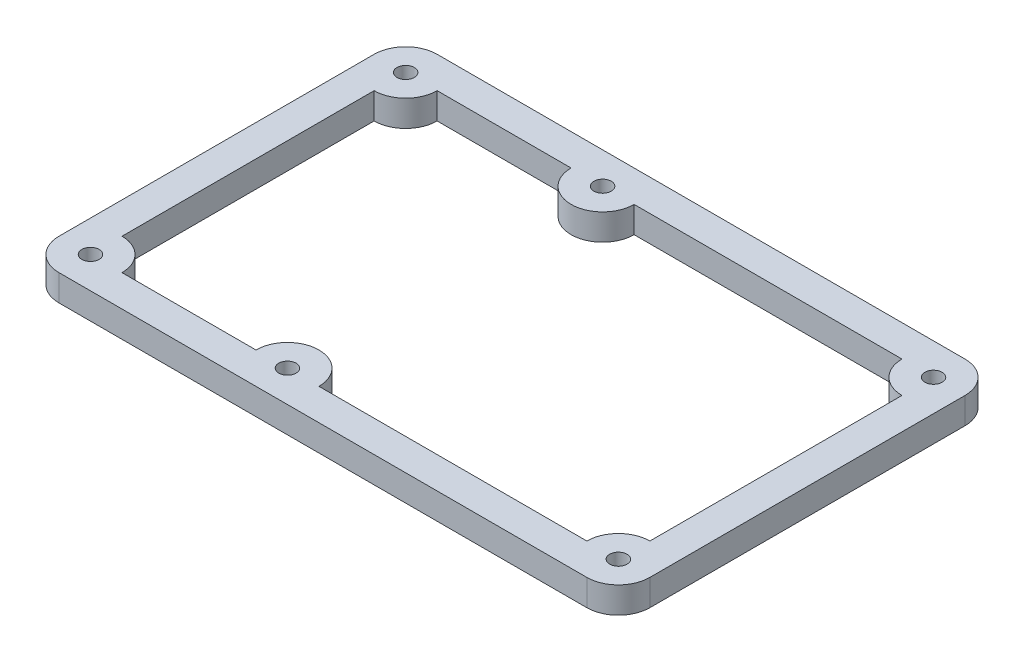
ISO-10303-21;
HEADER;
FILE_DESCRIPTION(('STEP AP214'),'2;1');
FILE_NAME('part.step','',(''),(''),'','','');
FILE_SCHEMA(('AUTOMOTIVE_DESIGN { 1 0 10303 214 1 1 1 1 }'));
ENDSEC;
DATA;
#1=APPLICATION_CONTEXT('core data for automotive mechanical design processes');
#2=APPLICATION_PROTOCOL_DEFINITION('international standard','automotive_design',2000,#1);
#3=PRODUCT_CONTEXT('',#1,'mechanical');
#4=PRODUCT('Part','Part','',(#3));
#5=PRODUCT_RELATED_PRODUCT_CATEGORY('part','',(#4));
#6=PRODUCT_DEFINITION_FORMATION('','',#4);
#7=PRODUCT_DEFINITION_CONTEXT('part definition',#1,'design');
#8=PRODUCT_DEFINITION('design','',#6,#7);
#9=PRODUCT_DEFINITION_SHAPE('','',#8);
#10=(LENGTH_UNIT() NAMED_UNIT(*) SI_UNIT(.MILLI.,.METRE.));
#11=(NAMED_UNIT(*) PLANE_ANGLE_UNIT() SI_UNIT($,.RADIAN.));
#12=(NAMED_UNIT(*) SI_UNIT($,.STERADIAN.) SOLID_ANGLE_UNIT());
#13=UNCERTAINTY_MEASURE_WITH_UNIT(LENGTH_MEASURE(1.E-05),#10,'distance_accuracy_value','');
#14=(GEOMETRIC_REPRESENTATION_CONTEXT(3) GLOBAL_UNCERTAINTY_ASSIGNED_CONTEXT((#13)) GLOBAL_UNIT_ASSIGNED_CONTEXT((#10,
#11,#12)) REPRESENTATION_CONTEXT('',''));
#15=CARTESIAN_POINT('',(0.,0.,0.));
#16=DIRECTION('',(0.,0.,1.));
#17=DIRECTION('',(1.,0.,0.));
#18=AXIS2_PLACEMENT_3D('',#15,#16,#17);
#19=CARTESIAN_POINT('',(-56.7858356822057,5.,-53.1366399068793));
#20=DIRECTION('',(0.,1.,0.));
#21=DIRECTION('',(0.,0.,1.));
#22=AXIS2_PLACEMENT_3D('',#19,#20,#21);
#23=PLANE('',#22);
#24=CARTESIAN_POINT('',(43.7141643177943,5.,6.86336009312072));
#25=DIRECTION('',(0.,1.,0.));
#26=DIRECTION('',(0.,0.,1.));
#27=AXIS2_PLACEMENT_3D('',#24,#25,#26);
#28=CIRCLE('',#27,1.65);
#29=CARTESIAN_POINT('',(43.7141643177943,5.,8.51336009312071));
#30=VERTEX_POINT('',#29);
#31=EDGE_CURVE('E263',#30,#30,#28,.T.);
#32=ORIENTED_EDGE('',*,*,#31,.F.);
#33=EDGE_LOOP('',(#32));
#34=FACE_BOUND('',#33,.T.);
#35=CARTESIAN_POINT('',(-56.7858356822057,5.,6.86336009312072));
#36=DIRECTION('',(0.,1.,0.));
#37=DIRECTION('',(0.,0.,1.));
#38=AXIS2_PLACEMENT_3D('',#35,#36,#37);
#39=CIRCLE('',#38,1.65);
#40=CARTESIAN_POINT('',(-56.7858356822057,5.,8.51336009312072));
#41=VERTEX_POINT('',#40);
#42=EDGE_CURVE('E275',#41,#41,#39,.T.);
#43=ORIENTED_EDGE('',*,*,#42,.F.);
#44=EDGE_LOOP('',(#43));
#45=FACE_BOUND('',#44,.T.);
#46=CARTESIAN_POINT('',(-19.2858356822057,5.,-53.1366399068793));
#47=DIRECTION('',(0.,1.,0.));
#48=DIRECTION('',(0.,0.,1.));
#49=AXIS2_PLACEMENT_3D('',#46,#47,#48);
#50=CIRCLE('',#49,1.65);
#51=CARTESIAN_POINT('',(-19.2858356822057,5.,-51.4866399068793));
#52=VERTEX_POINT('',#51);
#53=EDGE_CURVE('E287',#52,#52,#50,.T.);
#54=ORIENTED_EDGE('',*,*,#53,.F.);
#55=EDGE_LOOP('',(#54));
#56=FACE_BOUND('',#55,.T.);
#57=CARTESIAN_POINT('',(-56.7858356822057,5.,-53.1366399068793));
#58=DIRECTION('',(0.,1.,0.));
#59=DIRECTION('',(0.,0.,1.));
#60=AXIS2_PLACEMENT_3D('',#57,#58,#59);
#61=CIRCLE('',#60,6.00000000000001);
#62=CARTESIAN_POINT('',(-56.7858356822057,5.,-59.1366399068793));
#63=VERTEX_POINT('',#62);
#64=CARTESIAN_POINT('',(-62.7858356822058,5.,-53.1366399068793));
#65=VERTEX_POINT('',#64);
#66=EDGE_CURVE('E299',#63,#65,#61,.T.);
#67=ORIENTED_EDGE('',*,*,#66,.T.);
#68=DIRECTION('',(0.,0.,1.));
#69=VECTOR('',#68,1.);
#70=CARTESIAN_POINT('',(-62.7858356822058,5.,-53.1366399068793));
#71=LINE('',#70,#69);
#72=CARTESIAN_POINT('',(-62.7858356822058,5.,6.86336009312072));
#73=VERTEX_POINT('',#72);
#74=EDGE_CURVE('E302',#65,#73,#71,.T.);
#75=ORIENTED_EDGE('',*,*,#74,.T.);
#76=CARTESIAN_POINT('',(-56.7858356822057,5.,6.86336009312072));
#77=DIRECTION('',(0.,1.,0.));
#78=DIRECTION('',(0.,0.,1.));
#79=AXIS2_PLACEMENT_3D('',#76,#77,#78);
#80=CIRCLE('',#79,6.);
#81=CARTESIAN_POINT('',(-56.7858356822057,5.,12.8633600931207));
#82=VERTEX_POINT('',#81);
#83=EDGE_CURVE('E305',#73,#82,#80,.T.);
#84=ORIENTED_EDGE('',*,*,#83,.T.);
#85=DIRECTION('',(1.,0.,0.));
#86=VECTOR('',#85,1.);
#87=CARTESIAN_POINT('',(-56.7858356822057,5.,12.8633600931207));
#88=LINE('',#87,#86);
#89=CARTESIAN_POINT('',(43.7141643177943,5.,12.8633600931207));
#90=VERTEX_POINT('',#89);
#91=EDGE_CURVE('E307',#82,#90,#88,.T.);
#92=ORIENTED_EDGE('',*,*,#91,.T.);
#93=CARTESIAN_POINT('',(43.7141643177943,5.,6.86336009312072));
#94=DIRECTION('',(0.,1.,0.));
#95=DIRECTION('',(0.,0.,1.));
#96=AXIS2_PLACEMENT_3D('',#93,#94,#95);
#97=CIRCLE('',#96,6.);
#98=CARTESIAN_POINT('',(49.7141643177943,5.,6.86336009312072));
#99=VERTEX_POINT('',#98);
#100=EDGE_CURVE('E309',#90,#99,#97,.T.);
#101=ORIENTED_EDGE('',*,*,#100,.T.);
#102=DIRECTION('',(0.,0.,-1.));
#103=VECTOR('',#102,1.);
#104=CARTESIAN_POINT('',(49.7141643177943,5.,-53.1366399068793));
#105=LINE('',#104,#103);
#106=CARTESIAN_POINT('',(49.7141643177943,5.,-53.1366399068793));
#107=VERTEX_POINT('',#106);
#108=EDGE_CURVE('E311',#99,#107,#105,.T.);
#109=ORIENTED_EDGE('',*,*,#108,.T.);
#110=CARTESIAN_POINT('',(43.7141643177943,5.,-53.1366399068793));
#111=DIRECTION('',(0.,1.,0.));
#112=DIRECTION('',(0.,0.,1.));
#113=AXIS2_PLACEMENT_3D('',#110,#111,#112);
#114=CIRCLE('',#113,5.99999999999999);
#115=CARTESIAN_POINT('',(43.7141643177943,5.,-59.1366399068793));
#116=VERTEX_POINT('',#115);
#117=EDGE_CURVE('E313',#107,#116,#114,.T.);
#118=ORIENTED_EDGE('',*,*,#117,.T.);
#119=DIRECTION('',(-1.,0.,0.));
#120=VECTOR('',#119,1.);
#121=CARTESIAN_POINT('',(-56.7858356822057,5.,-59.1366399068793));
#122=LINE('',#121,#120);
#123=EDGE_CURVE('E315',#116,#63,#122,.T.);
#124=ORIENTED_EDGE('',*,*,#123,.T.);
#125=EDGE_LOOP('',(#67,#75,#84,#92,#101,#109,#118,#124));
#126=FACE_BOUND('',#125,.T.);
#127=CARTESIAN_POINT('',(-56.7858356822057,5.,-53.1366399068793));
#128=DIRECTION('',(0.,1.,0.));
#129=DIRECTION('',(0.,0.,1.));
#130=AXIS2_PLACEMENT_3D('',#127,#128,#129);
#131=CIRCLE('',#130,1.65);
#132=CARTESIAN_POINT('',(-56.7858356822057,5.,-51.4866399068793));
#133=VERTEX_POINT('',#132);
#134=EDGE_CURVE('E293',#133,#133,#131,.T.);
#135=ORIENTED_EDGE('',*,*,#134,.F.);
#136=EDGE_LOOP('',(#135));
#137=FACE_BOUND('',#136,.T.);
#138=CARTESIAN_POINT('',(43.7141643177943,5.,-53.1366399068793));
#139=DIRECTION('',(0.,1.,0.));
#140=DIRECTION('',(0.,0.,1.));
#141=AXIS2_PLACEMENT_3D('',#138,#139,#140);
#142=CIRCLE('',#141,1.65);
#143=CARTESIAN_POINT('',(43.7141643177943,5.,-51.4866399068793));
#144=VERTEX_POINT('',#143);
#145=EDGE_CURVE('E281',#144,#144,#142,.T.);
#146=ORIENTED_EDGE('',*,*,#145,.F.);
#147=EDGE_LOOP('',(#146));
#148=FACE_BOUND('',#147,.T.);
#149=CARTESIAN_POINT('',(-19.2858356822057,5.,6.86336009312072));
#150=DIRECTION('',(0.,1.,0.));
#151=DIRECTION('',(0.,0.,1.));
#152=AXIS2_PLACEMENT_3D('',#149,#150,#151);
#153=CIRCLE('',#152,1.65);
#154=CARTESIAN_POINT('',(-19.2858356822057,5.,8.51336009312072));
#155=VERTEX_POINT('',#154);
#156=EDGE_CURVE('E269',#155,#155,#153,.T.);
#157=ORIENTED_EDGE('',*,*,#156,.F.);
#158=EDGE_LOOP('',(#157));
#159=FACE_BOUND('',#158,.T.);
#160=DIRECTION('',(0.,0.,1.));
#161=VECTOR('',#160,1.);
#162=CARTESIAN_POINT('',(-56.7858356822057,5.,0.863360093120715));
#163=LINE('',#162,#161);
#164=CARTESIAN_POINT('',(-56.7858356822057,5.,-47.1366399068793));
#165=VERTEX_POINT('',#164);
#166=CARTESIAN_POINT('',(-56.7858356822057,5.,0.863360093120715));
#167=VERTEX_POINT('',#166);
#168=EDGE_CURVE('E178',#165,#167,#163,.T.);
#169=ORIENTED_EDGE('',*,*,#168,.F.);
#170=CARTESIAN_POINT('',(-56.7858356822057,5.,-53.1366399068793));
#171=DIRECTION('',(0.,-1.,0.));
#172=DIRECTION('',(0.,0.,1.));
#173=AXIS2_PLACEMENT_3D('',#170,#171,#172);
#174=CIRCLE('',#173,6.00000000000001);
#175=CARTESIAN_POINT('',(-50.7858356822057,5.,-53.1366399068793));
#176=VERTEX_POINT('',#175);
#177=EDGE_CURVE('E170',#176,#165,#174,.T.);
#178=ORIENTED_EDGE('',*,*,#177,.F.);
#179=DIRECTION('',(-1.,0.,0.));
#180=VECTOR('',#179,1.);
#181=CARTESIAN_POINT('',(-50.7858356822057,5.,-53.1366399068793));
#182=LINE('',#181,#180);
#183=CARTESIAN_POINT('',(-25.2858356822057,5.,-53.1366399068793));
#184=VERTEX_POINT('',#183);
#185=EDGE_CURVE('E211',#184,#176,#182,.T.);
#186=ORIENTED_EDGE('',*,*,#185,.F.);
#187=CARTESIAN_POINT('',(-19.2858356822057,5.,-53.1366399068793));
#188=DIRECTION('',(0.,-1.,0.));
#189=DIRECTION('',(0.,0.,1.));
#190=AXIS2_PLACEMENT_3D('',#187,#188,#189);
#191=CIRCLE('',#190,6.);
#192=CARTESIAN_POINT('',(-13.2858356822057,5.,-53.1366399068793));
#193=VERTEX_POINT('',#192);
#194=EDGE_CURVE('E209',#193,#184,#191,.T.);
#195=ORIENTED_EDGE('',*,*,#194,.F.);
#196=DIRECTION('',(-1.,0.,0.));
#197=VECTOR('',#196,1.);
#198=CARTESIAN_POINT('',(-13.2858356822057,5.,-53.1366399068793));
#199=LINE('',#198,#197);
#200=CARTESIAN_POINT('',(37.7141643177943,5.,-53.1366399068793));
#201=VERTEX_POINT('',#200);
#202=EDGE_CURVE('E207',#201,#193,#199,.T.);
#203=ORIENTED_EDGE('',*,*,#202,.F.);
#204=CARTESIAN_POINT('',(43.7141643177943,5.,-53.1366399068793));
#205=DIRECTION('',(0.,-1.,0.));
#206=DIRECTION('',(0.,0.,1.));
#207=AXIS2_PLACEMENT_3D('',#204,#205,#206);
#208=CIRCLE('',#207,5.99999999999999);
#209=CARTESIAN_POINT('',(43.7141643177943,5.,-47.1366399068793));
#210=VERTEX_POINT('',#209);
#211=EDGE_CURVE('E205',#210,#201,#208,.T.);
#212=ORIENTED_EDGE('',*,*,#211,.F.);
#213=DIRECTION('',(0.,0.,-1.));
#214=VECTOR('',#213,1.);
#215=CARTESIAN_POINT('',(43.7141643177943,5.,-47.1366399068793));
#216=LINE('',#215,#214);
#217=CARTESIAN_POINT('',(43.7141643177943,5.,0.863360093120722));
#218=VERTEX_POINT('',#217);
#219=EDGE_CURVE('E203',#218,#210,#216,.T.);
#220=ORIENTED_EDGE('',*,*,#219,.F.);
#221=CARTESIAN_POINT('',(43.7141643177943,5.,6.86336009312072));
#222=DIRECTION('',(0.,-1.,0.));
#223=DIRECTION('',(0.,0.,1.));
#224=AXIS2_PLACEMENT_3D('',#221,#222,#223);
#225=CIRCLE('',#224,6.);
#226=CARTESIAN_POINT('',(37.7141643177943,5.,6.86336009312072));
#227=VERTEX_POINT('',#226);
#228=EDGE_CURVE('E201',#227,#218,#225,.T.);
#229=ORIENTED_EDGE('',*,*,#228,.F.);
#230=DIRECTION('',(1.,0.,0.));
#231=VECTOR('',#230,1.);
#232=CARTESIAN_POINT('',(37.7141643177943,5.,6.86336009312072));
#233=LINE('',#232,#231);
#234=CARTESIAN_POINT('',(-13.2858356822057,5.,6.86336009312072));
#235=VERTEX_POINT('',#234);
#236=EDGE_CURVE('E199',#235,#227,#233,.T.);
#237=ORIENTED_EDGE('',*,*,#236,.F.);
#238=CARTESIAN_POINT('',(-19.2858356822057,5.,6.86336009312072));
#239=DIRECTION('',(0.,-1.,0.));
#240=DIRECTION('',(0.,0.,1.));
#241=AXIS2_PLACEMENT_3D('',#238,#239,#240);
#242=CIRCLE('',#241,6.);
#243=CARTESIAN_POINT('',(-25.2858356822057,5.,6.86336009312072));
#244=VERTEX_POINT('',#243);
#245=EDGE_CURVE('E197',#244,#235,#242,.T.);
#246=ORIENTED_EDGE('',*,*,#245,.F.);
#247=DIRECTION('',(1.,0.,0.));
#248=VECTOR('',#247,1.);
#249=CARTESIAN_POINT('',(-50.7858356822057,5.,6.86336009312072));
#250=LINE('',#249,#248);
#251=CARTESIAN_POINT('',(-50.7858356822057,5.,6.86336009312072));
#252=VERTEX_POINT('',#251);
#253=EDGE_CURVE('E193',#252,#244,#250,.T.);
#254=ORIENTED_EDGE('',*,*,#253,.F.);
#255=CARTESIAN_POINT('',(-56.7858356822057,5.,6.86336009312072));
#256=DIRECTION('',(0.,-1.,0.));
#257=DIRECTION('',(0.,0.,1.));
#258=AXIS2_PLACEMENT_3D('',#255,#256,#257);
#259=CIRCLE('',#258,6.);
#260=EDGE_CURVE('E191',#167,#252,#259,.T.);
#261=ORIENTED_EDGE('',*,*,#260,.F.);
#262=EDGE_LOOP('',(#169,#178,#186,#195,#203,#212,#220,#229,#237,#246,#254,#261));
#263=FACE_BOUND('',#262,.T.);
#264=ADVANCED_FACE('F33',(#34,#45,#56,#126,#137,#148,#159,#263),#23,.T.);
#265=CARTESIAN_POINT('',(-56.7858356822057,0.,-53.1366399068793));
#266=DIRECTION('',(0.,1.,0.));
#267=DIRECTION('',(0.,0.,1.));
#268=AXIS2_PLACEMENT_3D('',#265,#266,#267);
#269=PLANE('',#268);
#270=CARTESIAN_POINT('',(43.7141643177943,0.,6.86336009312072));
#271=DIRECTION('',(0.,1.,0.));
#272=DIRECTION('',(0.,0.,1.));
#273=AXIS2_PLACEMENT_3D('',#270,#271,#272);
#274=CIRCLE('',#273,1.65);
#275=CARTESIAN_POINT('',(43.7141643177943,0.,8.51336009312071));
#276=VERTEX_POINT('',#275);
#277=EDGE_CURVE('E186',#276,#276,#274,.T.);
#278=ORIENTED_EDGE('',*,*,#277,.T.);
#279=EDGE_LOOP('',(#278));
#280=FACE_BOUND('',#279,.T.);
#281=CARTESIAN_POINT('',(-56.7858356822057,0.,6.86336009312072));
#282=DIRECTION('',(0.,1.,0.));
#283=DIRECTION('',(0.,0.,1.));
#284=AXIS2_PLACEMENT_3D('',#281,#282,#283);
#285=CIRCLE('',#284,1.65);
#286=CARTESIAN_POINT('',(-56.7858356822057,0.,8.51336009312072));
#287=VERTEX_POINT('',#286);
#288=EDGE_CURVE('E272',#287,#287,#285,.T.);
#289=ORIENTED_EDGE('',*,*,#288,.T.);
#290=EDGE_LOOP('',(#289));
#291=FACE_BOUND('',#290,.T.);
#292=CARTESIAN_POINT('',(-19.2858356822057,0.,-53.1366399068793));
#293=DIRECTION('',(0.,1.,0.));
#294=DIRECTION('',(0.,0.,1.));
#295=AXIS2_PLACEMENT_3D('',#292,#293,#294);
#296=CIRCLE('',#295,1.65);
#297=CARTESIAN_POINT('',(-19.2858356822057,0.,-51.4866399068793));
#298=VERTEX_POINT('',#297);
#299=EDGE_CURVE('E284',#298,#298,#296,.T.);
#300=ORIENTED_EDGE('',*,*,#299,.T.);
#301=EDGE_LOOP('',(#300));
#302=FACE_BOUND('',#301,.T.);
#303=CARTESIAN_POINT('',(-56.7858356822057,0.,-53.1366399068793));
#304=DIRECTION('',(0.,1.,0.));
#305=DIRECTION('',(0.,0.,1.));
#306=AXIS2_PLACEMENT_3D('',#303,#304,#305);
#307=CIRCLE('',#306,6.00000000000001);
#308=CARTESIAN_POINT('',(-56.7858356822057,0.,-59.1366399068793));
#309=VERTEX_POINT('',#308);
#310=CARTESIAN_POINT('',(-62.7858356822058,0.,-53.1366399068793));
#311=VERTEX_POINT('',#310);
#312=EDGE_CURVE('E296',#309,#311,#307,.T.);
#313=ORIENTED_EDGE('',*,*,#312,.F.);
#314=DIRECTION('',(-1.,0.,0.));
#315=VECTOR('',#314,1.);
#316=CARTESIAN_POINT('',(-56.7858356822057,0.,-59.1366399068793));
#317=LINE('',#316,#315);
#318=CARTESIAN_POINT('',(43.7141643177943,0.,-59.1366399068793));
#319=VERTEX_POINT('',#318);
#320=EDGE_CURVE('E303',#319,#309,#317,.T.);
#321=ORIENTED_EDGE('',*,*,#320,.F.);
#322=CARTESIAN_POINT('',(43.7141643177943,0.,-53.1366399068793));
#323=DIRECTION('',(0.,1.,0.));
#324=DIRECTION('',(0.,0.,1.));
#325=AXIS2_PLACEMENT_3D('',#322,#323,#324);
#326=CIRCLE('',#325,5.99999999999999);
#327=CARTESIAN_POINT('',(49.7141643177943,0.,-53.1366399068793));
#328=VERTEX_POINT('',#327);
#329=EDGE_CURVE('E330',#328,#319,#326,.T.);
#330=ORIENTED_EDGE('',*,*,#329,.F.);
#331=DIRECTION('',(0.,0.,-1.));
#332=VECTOR('',#331,1.);
#333=CARTESIAN_POINT('',(49.7141643177943,0.,-53.1366399068793));
#334=LINE('',#333,#332);
#335=CARTESIAN_POINT('',(49.7141643177943,0.,6.86336009312072));
#336=VERTEX_POINT('',#335);
#337=EDGE_CURVE('E328',#336,#328,#334,.T.);
#338=ORIENTED_EDGE('',*,*,#337,.F.);
#339=CARTESIAN_POINT('',(43.7141643177943,0.,6.86336009312072));
#340=DIRECTION('',(0.,1.,0.));
#341=DIRECTION('',(0.,0.,1.));
#342=AXIS2_PLACEMENT_3D('',#339,#340,#341);
#343=CIRCLE('',#342,6.);
#344=CARTESIAN_POINT('',(43.7141643177943,0.,12.8633600931207));
#345=VERTEX_POINT('',#344);
#346=EDGE_CURVE('E326',#345,#336,#343,.T.);
#347=ORIENTED_EDGE('',*,*,#346,.F.);
#348=DIRECTION('',(1.,0.,0.));
#349=VECTOR('',#348,1.);
#350=CARTESIAN_POINT('',(-56.7858356822057,0.,12.8633600931207));
#351=LINE('',#350,#349);
#352=CARTESIAN_POINT('',(-56.7858356822057,0.,12.8633600931207));
#353=VERTEX_POINT('',#352);
#354=EDGE_CURVE('E324',#353,#345,#351,.T.);
#355=ORIENTED_EDGE('',*,*,#354,.F.);
#356=CARTESIAN_POINT('',(-56.7858356822057,0.,6.86336009312072));
#357=DIRECTION('',(0.,1.,0.));
#358=DIRECTION('',(0.,0.,1.));
#359=AXIS2_PLACEMENT_3D('',#356,#357,#358);
#360=CIRCLE('',#359,6.);
#361=CARTESIAN_POINT('',(-62.7858356822058,0.,6.86336009312072));
#362=VERTEX_POINT('',#361);
#363=EDGE_CURVE('E322',#362,#353,#360,.T.);
#364=ORIENTED_EDGE('',*,*,#363,.F.);
#365=DIRECTION('',(0.,0.,1.));
#366=VECTOR('',#365,1.);
#367=CARTESIAN_POINT('',(-62.7858356822058,0.,-53.1366399068793));
#368=LINE('',#367,#366);
#369=EDGE_CURVE('E320',#311,#362,#368,.T.);
#370=ORIENTED_EDGE('',*,*,#369,.F.);
#371=EDGE_LOOP('',(#313,#321,#330,#338,#347,#355,#364,#370));
#372=FACE_BOUND('',#371,.T.);
#373=CARTESIAN_POINT('',(-56.7858356822057,0.,-53.1366399068793));
#374=DIRECTION('',(0.,1.,0.));
#375=DIRECTION('',(0.,0.,1.));
#376=AXIS2_PLACEMENT_3D('',#373,#374,#375);
#377=CIRCLE('',#376,1.65);
#378=CARTESIAN_POINT('',(-56.7858356822057,0.,-51.4866399068793));
#379=VERTEX_POINT('',#378);
#380=EDGE_CURVE('E290',#379,#379,#377,.T.);
#381=ORIENTED_EDGE('',*,*,#380,.T.);
#382=EDGE_LOOP('',(#381));
#383=FACE_BOUND('',#382,.T.);
#384=CARTESIAN_POINT('',(43.7141643177943,0.,-53.1366399068793));
#385=DIRECTION('',(0.,1.,0.));
#386=DIRECTION('',(0.,0.,1.));
#387=AXIS2_PLACEMENT_3D('',#384,#385,#386);
#388=CIRCLE('',#387,1.65);
#389=CARTESIAN_POINT('',(43.7141643177943,0.,-51.4866399068793));
#390=VERTEX_POINT('',#389);
#391=EDGE_CURVE('E278',#390,#390,#388,.T.);
#392=ORIENTED_EDGE('',*,*,#391,.T.);
#393=EDGE_LOOP('',(#392));
#394=FACE_BOUND('',#393,.T.);
#395=CARTESIAN_POINT('',(-19.2858356822057,0.,6.86336009312072));
#396=DIRECTION('',(0.,1.,0.));
#397=DIRECTION('',(0.,0.,1.));
#398=AXIS2_PLACEMENT_3D('',#395,#396,#397);
#399=CIRCLE('',#398,1.65);
#400=CARTESIAN_POINT('',(-19.2858356822057,0.,8.51336009312072));
#401=VERTEX_POINT('',#400);
#402=EDGE_CURVE('E266',#401,#401,#399,.T.);
#403=ORIENTED_EDGE('',*,*,#402,.T.);
#404=EDGE_LOOP('',(#403));
#405=FACE_BOUND('',#404,.T.);
#406=CARTESIAN_POINT('',(-56.7858356822057,0.,-53.1366399068793));
#407=DIRECTION('',(0.,-1.,0.));
#408=DIRECTION('',(0.,0.,1.));
#409=AXIS2_PLACEMENT_3D('',#406,#407,#408);
#410=CIRCLE('',#409,6.00000000000001);
#411=CARTESIAN_POINT('',(-50.7858356822057,0.,-53.1366399068793));
#412=VERTEX_POINT('',#411);
#413=CARTESIAN_POINT('',(-56.7858356822057,0.,-47.1366399068793));
#414=VERTEX_POINT('',#413);
#415=EDGE_CURVE('E56',#412,#414,#410,.T.);
#416=ORIENTED_EDGE('',*,*,#415,.T.);
#417=DIRECTION('',(0.,0.,1.));
#418=VECTOR('',#417,1.);
#419=CARTESIAN_POINT('',(-56.7858356822057,0.,0.863360093120715));
#420=LINE('',#419,#418);
#421=CARTESIAN_POINT('',(-56.7858356822057,0.,0.863360093120715));
#422=VERTEX_POINT('',#421);
#423=EDGE_CURVE('E185',#414,#422,#420,.T.);
#424=ORIENTED_EDGE('',*,*,#423,.T.);
#425=CARTESIAN_POINT('',(-56.7858356822057,0.,6.86336009312072));
#426=DIRECTION('',(0.,-1.,0.));
#427=DIRECTION('',(0.,0.,1.));
#428=AXIS2_PLACEMENT_3D('',#425,#426,#427);
#429=CIRCLE('',#428,6.);
#430=CARTESIAN_POINT('',(-50.7858356822057,0.,6.86336009312072));
#431=VERTEX_POINT('',#430);
#432=EDGE_CURVE('E215',#422,#431,#429,.T.);
#433=ORIENTED_EDGE('',*,*,#432,.T.);
#434=DIRECTION('',(1.,0.,0.));
#435=VECTOR('',#434,1.);
#436=CARTESIAN_POINT('',(-50.7858356822057,0.,6.86336009312072));
#437=LINE('',#436,#435);
#438=CARTESIAN_POINT('',(-25.2858356822057,0.,6.86336009312072));
#439=VERTEX_POINT('',#438);
#440=EDGE_CURVE('E218',#431,#439,#437,.T.);
#441=ORIENTED_EDGE('',*,*,#440,.T.);
#442=CARTESIAN_POINT('',(-19.2858356822057,0.,6.86336009312072));
#443=DIRECTION('',(0.,-1.,0.));
#444=DIRECTION('',(0.,0.,1.));
#445=AXIS2_PLACEMENT_3D('',#442,#443,#444);
#446=CIRCLE('',#445,6.);
#447=CARTESIAN_POINT('',(-13.2858356822057,0.,6.86336009312072));
#448=VERTEX_POINT('',#447);
#449=EDGE_CURVE('E221',#439,#448,#446,.T.);
#450=ORIENTED_EDGE('',*,*,#449,.T.);
#451=DIRECTION('',(1.,0.,0.));
#452=VECTOR('',#451,1.);
#453=CARTESIAN_POINT('',(37.7141643177943,0.,6.86336009312072));
#454=LINE('',#453,#452);
#455=CARTESIAN_POINT('',(37.7141643177943,0.,6.86336009312072));
#456=VERTEX_POINT('',#455);
#457=EDGE_CURVE('E224',#448,#456,#454,.T.);
#458=ORIENTED_EDGE('',*,*,#457,.T.);
#459=CARTESIAN_POINT('',(43.7141643177943,0.,6.86336009312072));
#460=DIRECTION('',(0.,-1.,0.));
#461=DIRECTION('',(0.,0.,1.));
#462=AXIS2_PLACEMENT_3D('',#459,#460,#461);
#463=CIRCLE('',#462,6.);
#464=CARTESIAN_POINT('',(43.7141643177943,0.,0.863360093120722));
#465=VERTEX_POINT('',#464);
#466=EDGE_CURVE('E227',#456,#465,#463,.T.);
#467=ORIENTED_EDGE('',*,*,#466,.T.);
#468=DIRECTION('',(0.,0.,-1.));
#469=VECTOR('',#468,1.);
#470=CARTESIAN_POINT('',(43.7141643177943,0.,-47.1366399068793));
#471=LINE('',#470,#469);
#472=CARTESIAN_POINT('',(43.7141643177943,0.,-47.1366399068793));
#473=VERTEX_POINT('',#472);
#474=EDGE_CURVE('E230',#465,#473,#471,.T.);
#475=ORIENTED_EDGE('',*,*,#474,.T.);
#476=CARTESIAN_POINT('',(43.7141643177943,0.,-53.1366399068793));
#477=DIRECTION('',(0.,-1.,0.));
#478=DIRECTION('',(0.,0.,1.));
#479=AXIS2_PLACEMENT_3D('',#476,#477,#478);
#480=CIRCLE('',#479,5.99999999999999);
#481=CARTESIAN_POINT('',(37.7141643177943,0.,-53.1366399068793));
#482=VERTEX_POINT('',#481);
#483=EDGE_CURVE('E233',#473,#482,#480,.T.);
#484=ORIENTED_EDGE('',*,*,#483,.T.);
#485=DIRECTION('',(-1.,0.,0.));
#486=VECTOR('',#485,1.);
#487=CARTESIAN_POINT('',(-13.2858356822057,0.,-53.1366399068793));
#488=LINE('',#487,#486);
#489=CARTESIAN_POINT('',(-13.2858356822057,0.,-53.1366399068793));
#490=VERTEX_POINT('',#489);
#491=EDGE_CURVE('E236',#482,#490,#488,.T.);
#492=ORIENTED_EDGE('',*,*,#491,.T.);
#493=CARTESIAN_POINT('',(-19.2858356822057,0.,-53.1366399068793));
#494=DIRECTION('',(0.,-1.,0.));
#495=DIRECTION('',(0.,0.,1.));
#496=AXIS2_PLACEMENT_3D('',#493,#494,#495);
#497=CIRCLE('',#496,6.);
#498=CARTESIAN_POINT('',(-25.2858356822057,0.,-53.1366399068793));
#499=VERTEX_POINT('',#498);
#500=EDGE_CURVE('E239',#490,#499,#497,.T.);
#501=ORIENTED_EDGE('',*,*,#500,.T.);
#502=DIRECTION('',(-1.,0.,0.));
#503=VECTOR('',#502,1.);
#504=CARTESIAN_POINT('',(-50.7858356822057,0.,-53.1366399068793));
#505=LINE('',#504,#503);
#506=EDGE_CURVE('E179',#499,#412,#505,.T.);
#507=ORIENTED_EDGE('',*,*,#506,.T.);
#508=EDGE_LOOP('',(#416,#424,#433,#441,#450,#458,#467,#475,#484,#492,#501,#507));
#509=FACE_BOUND('',#508,.T.);
#510=ADVANCED_FACE('F360',(#280,#291,#302,#372,#383,#394,#405,#509),#269,.F.);
#511=CARTESIAN_POINT('',(-56.7858356822057,5.,-53.1366399068793));
#512=DIRECTION('',(0.,-1.,0.));
#513=DIRECTION('',(0.,0.,-1.));
#514=AXIS2_PLACEMENT_3D('',#511,#512,#513);
#515=CYLINDRICAL_SURFACE('',#514,6.00000000000001);
#516=ORIENTED_EDGE('',*,*,#312,.T.);
#517=DIRECTION('',(0.,-1.,0.));
#518=VECTOR('',#517,1.);
#519=CARTESIAN_POINT('',(-62.7858356822058,5.,-53.1366399068793));
#520=LINE('',#519,#518);
#521=EDGE_CURVE('E11',#65,#311,#520,.T.);
#522=ORIENTED_EDGE('',*,*,#521,.F.);
#523=ORIENTED_EDGE('',*,*,#66,.F.);
#524=DIRECTION('',(0.,-1.,0.));
#525=VECTOR('',#524,1.);
#526=CARTESIAN_POINT('',(-56.7858356822057,5.,-59.1366399068793));
#527=LINE('',#526,#525);
#528=EDGE_CURVE('E317',#63,#309,#527,.T.);
#529=ORIENTED_EDGE('',*,*,#528,.T.);
#530=EDGE_LOOP('',(#516,#522,#523,#529));
#531=FACE_BOUND('',#530,.T.);
#532=ADVANCED_FACE('F35',(#531),#515,.T.);
#533=CARTESIAN_POINT('',(-62.7858356822058,5.,-53.1366399068793));
#534=DIRECTION('',(1.,0.,0.));
#535=DIRECTION('',(0.,0.,-1.));
#536=AXIS2_PLACEMENT_3D('',#533,#534,#535);
#537=PLANE('',#536);
#538=ORIENTED_EDGE('',*,*,#369,.T.);
#539=DIRECTION('',(0.,-1.,0.));
#540=VECTOR('',#539,1.);
#541=CARTESIAN_POINT('',(-62.7858356822058,5.,6.86336009312072));
#542=LINE('',#541,#540);
#543=EDGE_CURVE('E41',#73,#362,#542,.T.);
#544=ORIENTED_EDGE('',*,*,#543,.F.);
#545=ORIENTED_EDGE('',*,*,#74,.F.);
#546=ORIENTED_EDGE('',*,*,#521,.T.);
#547=EDGE_LOOP('',(#538,#544,#545,#546));
#548=FACE_BOUND('',#547,.T.);
#549=ADVANCED_FACE('F378',(#548),#537,.F.);
#550=CARTESIAN_POINT('',(-56.7858356822057,5.,6.86336009312072));
#551=DIRECTION('',(0.,-1.,0.));
#552=DIRECTION('',(0.,0.,-1.));
#553=AXIS2_PLACEMENT_3D('',#550,#551,#552);
#554=CYLINDRICAL_SURFACE('',#553,6.);
#555=ORIENTED_EDGE('',*,*,#363,.T.);
#556=DIRECTION('',(0.,-1.,0.));
#557=VECTOR('',#556,1.);
#558=CARTESIAN_POINT('',(-56.7858356822057,5.,12.8633600931207));
#559=LINE('',#558,#557);
#560=EDGE_CURVE('E347',#82,#353,#559,.T.);
#561=ORIENTED_EDGE('',*,*,#560,.F.);
#562=ORIENTED_EDGE('',*,*,#83,.F.);
#563=ORIENTED_EDGE('',*,*,#543,.T.);
#564=EDGE_LOOP('',(#555,#561,#562,#563));
#565=FACE_BOUND('',#564,.T.);
#566=ADVANCED_FACE('F354',(#565),#554,.T.);
#567=CARTESIAN_POINT('',(-56.7858356822057,5.,12.8633600931207));
#568=DIRECTION('',(0.,0.,-1.));
#569=DIRECTION('',(-1.,0.,0.));
#570=AXIS2_PLACEMENT_3D('',#567,#568,#569);
#571=PLANE('',#570);
#572=ORIENTED_EDGE('',*,*,#354,.T.);
#573=DIRECTION('',(0.,-1.,0.));
#574=VECTOR('',#573,1.);
#575=CARTESIAN_POINT('',(43.7141643177943,5.,12.8633600931207));
#576=LINE('',#575,#574);
#577=EDGE_CURVE('E344',#90,#345,#576,.T.);
#578=ORIENTED_EDGE('',*,*,#577,.F.);
#579=ORIENTED_EDGE('',*,*,#91,.F.);
#580=ORIENTED_EDGE('',*,*,#560,.T.);
#581=EDGE_LOOP('',(#572,#578,#579,#580));
#582=FACE_BOUND('',#581,.T.);
#583=ADVANCED_FACE('F366',(#582),#571,.F.);
#584=CARTESIAN_POINT('',(43.7141643177943,5.,6.86336009312072));
#585=DIRECTION('',(0.,-1.,0.));
#586=DIRECTION('',(0.,0.,-1.));
#587=AXIS2_PLACEMENT_3D('',#584,#585,#586);
#588=CYLINDRICAL_SURFACE('',#587,6.);
#589=ORIENTED_EDGE('',*,*,#346,.T.);
#590=DIRECTION('',(0.,-1.,0.));
#591=VECTOR('',#590,1.);
#592=CARTESIAN_POINT('',(49.7141643177943,5.,6.86336009312072));
#593=LINE('',#592,#591);
#594=EDGE_CURVE('E341',#99,#336,#593,.T.);
#595=ORIENTED_EDGE('',*,*,#594,.F.);
#596=ORIENTED_EDGE('',*,*,#100,.F.);
#597=ORIENTED_EDGE('',*,*,#577,.T.);
#598=EDGE_LOOP('',(#589,#595,#596,#597));
#599=FACE_BOUND('',#598,.T.);
#600=ADVANCED_FACE('F370',(#599),#588,.T.);
#601=CARTESIAN_POINT('',(49.7141643177943,5.,-53.1366399068793));
#602=DIRECTION('',(-1.,0.,0.));
#603=DIRECTION('',(0.,0.,1.));
#604=AXIS2_PLACEMENT_3D('',#601,#602,#603);
#605=PLANE('',#604);
#606=ORIENTED_EDGE('',*,*,#337,.T.);
#607=DIRECTION('',(0.,-1.,0.));
#608=VECTOR('',#607,1.);
#609=CARTESIAN_POINT('',(49.7141643177943,5.,-53.1366399068793));
#610=LINE('',#609,#608);
#611=EDGE_CURVE('E338',#107,#328,#610,.T.);
#612=ORIENTED_EDGE('',*,*,#611,.F.);
#613=ORIENTED_EDGE('',*,*,#108,.F.);
#614=ORIENTED_EDGE('',*,*,#594,.T.);
#615=EDGE_LOOP('',(#606,#612,#613,#614));
#616=FACE_BOUND('',#615,.T.);
#617=ADVANCED_FACE('F391',(#616),#605,.F.);
#618=CARTESIAN_POINT('',(43.7141643177943,5.,-53.1366399068793));
#619=DIRECTION('',(0.,-1.,0.));
#620=DIRECTION('',(0.,0.,-1.));
#621=AXIS2_PLACEMENT_3D('',#618,#619,#620);
#622=CYLINDRICAL_SURFACE('',#621,5.99999999999999);
#623=ORIENTED_EDGE('',*,*,#329,.T.);
#624=DIRECTION('',(0.,-1.,0.));
#625=VECTOR('',#624,1.);
#626=CARTESIAN_POINT('',(43.7141643177943,5.,-59.1366399068793));
#627=LINE('',#626,#625);
#628=EDGE_CURVE('E335',#116,#319,#627,.T.);
#629=ORIENTED_EDGE('',*,*,#628,.F.);
#630=ORIENTED_EDGE('',*,*,#117,.F.);
#631=ORIENTED_EDGE('',*,*,#611,.T.);
#632=EDGE_LOOP('',(#623,#629,#630,#631));
#633=FACE_BOUND('',#632,.T.);
#634=ADVANCED_FACE('F389',(#633),#622,.T.);
#635=CARTESIAN_POINT('',(-56.7858356822057,5.,-59.1366399068793));
#636=DIRECTION('',(0.,0.,1.));
#637=DIRECTION('',(1.,0.,0.));
#638=AXIS2_PLACEMENT_3D('',#635,#636,#637);
#639=PLANE('',#638);
#640=ORIENTED_EDGE('',*,*,#320,.T.);
#641=ORIENTED_EDGE('',*,*,#528,.F.);
#642=ORIENTED_EDGE('',*,*,#123,.F.);
#643=ORIENTED_EDGE('',*,*,#628,.T.);
#644=EDGE_LOOP('',(#640,#641,#642,#643));
#645=FACE_BOUND('',#644,.T.);
#646=ADVANCED_FACE('F384',(#645),#639,.F.);
#647=CARTESIAN_POINT('',(-56.7858356822057,5.,-53.1366399068793));
#648=DIRECTION('',(0.,-1.,0.));
#649=DIRECTION('',(0.,0.,-1.));
#650=AXIS2_PLACEMENT_3D('',#647,#648,#649);
#651=CYLINDRICAL_SURFACE('',#650,1.65);
#652=ORIENTED_EDGE('',*,*,#134,.T.);
#653=EDGE_LOOP('',(#652));
#654=FACE_BOUND('',#653,.T.);
#655=ORIENTED_EDGE('',*,*,#380,.F.);
#656=EDGE_LOOP('',(#655));
#657=FACE_BOUND('',#656,.T.);
#658=ADVANCED_FACE('F411',(#654,#657),#651,.F.);
#659=CARTESIAN_POINT('',(-19.2858356822057,5.,-53.1366399068793));
#660=DIRECTION('',(0.,-1.,0.));
#661=DIRECTION('',(0.,0.,-1.));
#662=AXIS2_PLACEMENT_3D('',#659,#660,#661);
#663=CYLINDRICAL_SURFACE('',#662,1.65);
#664=ORIENTED_EDGE('',*,*,#53,.T.);
#665=EDGE_LOOP('',(#664));
#666=FACE_BOUND('',#665,.T.);
#667=ORIENTED_EDGE('',*,*,#299,.F.);
#668=EDGE_LOOP('',(#667));
#669=FACE_BOUND('',#668,.T.);
#670=ADVANCED_FACE('F418',(#666,#669),#663,.F.);
#671=CARTESIAN_POINT('',(43.7141643177943,5.,-53.1366399068793));
#672=DIRECTION('',(0.,-1.,0.));
#673=DIRECTION('',(0.,0.,-1.));
#674=AXIS2_PLACEMENT_3D('',#671,#672,#673);
#675=CYLINDRICAL_SURFACE('',#674,1.65);
#676=ORIENTED_EDGE('',*,*,#145,.T.);
#677=EDGE_LOOP('',(#676));
#678=FACE_BOUND('',#677,.T.);
#679=ORIENTED_EDGE('',*,*,#391,.F.);
#680=EDGE_LOOP('',(#679));
#681=FACE_BOUND('',#680,.T.);
#682=ADVANCED_FACE('F423',(#678,#681),#675,.F.);
#683=CARTESIAN_POINT('',(-56.7858356822057,5.,6.86336009312072));
#684=DIRECTION('',(0.,-1.,0.));
#685=DIRECTION('',(0.,0.,-1.));
#686=AXIS2_PLACEMENT_3D('',#683,#684,#685);
#687=CYLINDRICAL_SURFACE('',#686,1.65);
#688=ORIENTED_EDGE('',*,*,#42,.T.);
#689=EDGE_LOOP('',(#688));
#690=FACE_BOUND('',#689,.T.);
#691=ORIENTED_EDGE('',*,*,#288,.F.);
#692=EDGE_LOOP('',(#691));
#693=FACE_BOUND('',#692,.T.);
#694=ADVANCED_FACE('F495',(#690,#693),#687,.F.);
#695=CARTESIAN_POINT('',(-19.2858356822057,5.,6.86336009312072));
#696=DIRECTION('',(0.,-1.,0.));
#697=DIRECTION('',(0.,0.,-1.));
#698=AXIS2_PLACEMENT_3D('',#695,#696,#697);
#699=CYLINDRICAL_SURFACE('',#698,1.65);
#700=ORIENTED_EDGE('',*,*,#156,.T.);
#701=EDGE_LOOP('',(#700));
#702=FACE_BOUND('',#701,.T.);
#703=ORIENTED_EDGE('',*,*,#402,.F.);
#704=EDGE_LOOP('',(#703));
#705=FACE_BOUND('',#704,.T.);
#706=ADVANCED_FACE('F491',(#702,#705),#699,.F.);
#707=CARTESIAN_POINT('',(43.7141643177943,5.,6.86336009312072));
#708=DIRECTION('',(0.,-1.,0.));
#709=DIRECTION('',(0.,0.,-1.));
#710=AXIS2_PLACEMENT_3D('',#707,#708,#709);
#711=CYLINDRICAL_SURFACE('',#710,1.65);
#712=ORIENTED_EDGE('',*,*,#31,.T.);
#713=EDGE_LOOP('',(#712));
#714=FACE_BOUND('',#713,.T.);
#715=ORIENTED_EDGE('',*,*,#277,.F.);
#716=EDGE_LOOP('',(#715));
#717=FACE_BOUND('',#716,.T.);
#718=ADVANCED_FACE('F488',(#714,#717),#711,.F.);
#719=CARTESIAN_POINT('',(-56.7858356822057,5.,-53.1366399068793));
#720=DIRECTION('',(0.,-1.,0.));
#721=DIRECTION('',(0.,0.,-1.));
#722=AXIS2_PLACEMENT_3D('',#719,#720,#721);
#723=CYLINDRICAL_SURFACE('',#722,6.00000000000001);
#724=ORIENTED_EDGE('',*,*,#415,.F.);
#725=DIRECTION('',(0.,-1.,0.));
#726=VECTOR('',#725,1.);
#727=CARTESIAN_POINT('',(-50.7858356822057,5.,-53.1366399068793));
#728=LINE('',#727,#726);
#729=EDGE_CURVE('E174',#176,#412,#728,.T.);
#730=ORIENTED_EDGE('',*,*,#729,.F.);
#731=ORIENTED_EDGE('',*,*,#177,.T.);
#732=DIRECTION('',(0.,-1.,0.));
#733=VECTOR('',#732,1.);
#734=CARTESIAN_POINT('',(-56.7858356822057,5.,-47.1366399068793));
#735=LINE('',#734,#733);
#736=EDGE_CURVE('E173',#165,#414,#735,.T.);
#737=ORIENTED_EDGE('',*,*,#736,.T.);
#738=EDGE_LOOP('',(#724,#730,#731,#737));
#739=FACE_BOUND('',#738,.T.);
#740=ADVANCED_FACE('F172',(#739),#723,.T.);
#741=CARTESIAN_POINT('',(-56.7858356822057,5.,0.863360093120715));
#742=DIRECTION('',(1.,0.,0.));
#743=DIRECTION('',(0.,0.,-1.));
#744=AXIS2_PLACEMENT_3D('',#741,#742,#743);
#745=PLANE('',#744);
#746=ORIENTED_EDGE('',*,*,#423,.F.);
#747=ORIENTED_EDGE('',*,*,#736,.F.);
#748=ORIENTED_EDGE('',*,*,#168,.T.);
#749=DIRECTION('',(0.,-1.,0.));
#750=VECTOR('',#749,1.);
#751=CARTESIAN_POINT('',(-56.7858356822057,5.,0.863360093120715));
#752=LINE('',#751,#750);
#753=EDGE_CURVE('E187',#167,#422,#752,.T.);
#754=ORIENTED_EDGE('',*,*,#753,.T.);
#755=EDGE_LOOP('',(#746,#747,#748,#754));
#756=FACE_BOUND('',#755,.T.);
#757=ADVANCED_FACE('F182',(#756),#745,.T.);
#758=CARTESIAN_POINT('',(-56.7858356822057,5.,6.86336009312072));
#759=DIRECTION('',(0.,-1.,0.));
#760=DIRECTION('',(0.,0.,-1.));
#761=AXIS2_PLACEMENT_3D('',#758,#759,#760);
#762=CYLINDRICAL_SURFACE('',#761,6.);
#763=ORIENTED_EDGE('',*,*,#432,.F.);
#764=ORIENTED_EDGE('',*,*,#753,.F.);
#765=ORIENTED_EDGE('',*,*,#260,.T.);
#766=DIRECTION('',(0.,-1.,0.));
#767=VECTOR('',#766,1.);
#768=CARTESIAN_POINT('',(-50.7858356822057,5.,6.86336009312072));
#769=LINE('',#768,#767);
#770=EDGE_CURVE('E260',#252,#431,#769,.T.);
#771=ORIENTED_EDGE('',*,*,#770,.T.);
#772=EDGE_LOOP('',(#763,#764,#765,#771));
#773=FACE_BOUND('',#772,.T.);
#774=ADVANCED_FACE('F475',(#773),#762,.T.);
#775=CARTESIAN_POINT('',(-50.7858356822057,5.,6.86336009312072));
#776=DIRECTION('',(0.,0.,-1.));
#777=DIRECTION('',(-1.,0.,0.));
#778=AXIS2_PLACEMENT_3D('',#775,#776,#777);
#779=PLANE('',#778);
#780=ORIENTED_EDGE('',*,*,#440,.F.);
#781=ORIENTED_EDGE('',*,*,#770,.F.);
#782=ORIENTED_EDGE('',*,*,#253,.T.);
#783=DIRECTION('',(0.,-1.,0.));
#784=VECTOR('',#783,1.);
#785=CARTESIAN_POINT('',(-25.2858356822057,5.,6.86336009312072));
#786=LINE('',#785,#784);
#787=EDGE_CURVE('E258',#244,#439,#786,.T.);
#788=ORIENTED_EDGE('',*,*,#787,.T.);
#789=EDGE_LOOP('',(#780,#781,#782,#788));
#790=FACE_BOUND('',#789,.T.);
#791=ADVANCED_FACE('F471',(#790),#779,.T.);
#792=CARTESIAN_POINT('',(-19.2858356822057,5.,6.86336009312072));
#793=DIRECTION('',(0.,-1.,0.));
#794=DIRECTION('',(0.,0.,-1.));
#795=AXIS2_PLACEMENT_3D('',#792,#793,#794);
#796=CYLINDRICAL_SURFACE('',#795,6.);
#797=ORIENTED_EDGE('',*,*,#449,.F.);
#798=ORIENTED_EDGE('',*,*,#787,.F.);
#799=ORIENTED_EDGE('',*,*,#245,.T.);
#800=DIRECTION('',(0.,-1.,0.));
#801=VECTOR('',#800,1.);
#802=CARTESIAN_POINT('',(-13.2858356822057,5.,6.86336009312072));
#803=LINE('',#802,#801);
#804=EDGE_CURVE('E256',#235,#448,#803,.T.);
#805=ORIENTED_EDGE('',*,*,#804,.T.);
#806=EDGE_LOOP('',(#797,#798,#799,#805));
#807=FACE_BOUND('',#806,.T.);
#808=ADVANCED_FACE('F468',(#807),#796,.T.);
#809=CARTESIAN_POINT('',(37.7141643177943,5.,6.86336009312072));
#810=DIRECTION('',(0.,0.,-1.));
#811=DIRECTION('',(-1.,0.,0.));
#812=AXIS2_PLACEMENT_3D('',#809,#810,#811);
#813=PLANE('',#812);
#814=ORIENTED_EDGE('',*,*,#457,.F.);
#815=ORIENTED_EDGE('',*,*,#804,.F.);
#816=ORIENTED_EDGE('',*,*,#236,.T.);
#817=DIRECTION('',(0.,-1.,0.));
#818=VECTOR('',#817,1.);
#819=CARTESIAN_POINT('',(37.7141643177943,5.,6.86336009312072));
#820=LINE('',#819,#818);
#821=EDGE_CURVE('E254',#227,#456,#820,.T.);
#822=ORIENTED_EDGE('',*,*,#821,.T.);
#823=EDGE_LOOP('',(#814,#815,#816,#822));
#824=FACE_BOUND('',#823,.T.);
#825=ADVANCED_FACE('F462',(#824),#813,.T.);
#826=CARTESIAN_POINT('',(43.7141643177943,5.,6.86336009312072));
#827=DIRECTION('',(0.,-1.,0.));
#828=DIRECTION('',(0.,0.,-1.));
#829=AXIS2_PLACEMENT_3D('',#826,#827,#828);
#830=CYLINDRICAL_SURFACE('',#829,6.);
#831=ORIENTED_EDGE('',*,*,#466,.F.);
#832=ORIENTED_EDGE('',*,*,#821,.F.);
#833=ORIENTED_EDGE('',*,*,#228,.T.);
#834=DIRECTION('',(0.,-1.,0.));
#835=VECTOR('',#834,1.);
#836=CARTESIAN_POINT('',(43.7141643177943,5.,0.863360093120722));
#837=LINE('',#836,#835);
#838=EDGE_CURVE('E252',#218,#465,#837,.T.);
#839=ORIENTED_EDGE('',*,*,#838,.T.);
#840=EDGE_LOOP('',(#831,#832,#833,#839));
#841=FACE_BOUND('',#840,.T.);
#842=ADVANCED_FACE('F458',(#841),#830,.T.);
#843=CARTESIAN_POINT('',(43.7141643177943,5.,-47.1366399068793));
#844=DIRECTION('',(-1.,0.,0.));
#845=DIRECTION('',(0.,0.,1.));
#846=AXIS2_PLACEMENT_3D('',#843,#844,#845);
#847=PLANE('',#846);
#848=ORIENTED_EDGE('',*,*,#474,.F.);
#849=ORIENTED_EDGE('',*,*,#838,.F.);
#850=ORIENTED_EDGE('',*,*,#219,.T.);
#851=DIRECTION('',(0.,-1.,0.));
#852=VECTOR('',#851,1.);
#853=CARTESIAN_POINT('',(43.7141643177943,5.,-47.1366399068793));
#854=LINE('',#853,#852);
#855=EDGE_CURVE('E250',#210,#473,#854,.T.);
#856=ORIENTED_EDGE('',*,*,#855,.T.);
#857=EDGE_LOOP('',(#848,#849,#850,#856));
#858=FACE_BOUND('',#857,.T.);
#859=ADVANCED_FACE('F455',(#858),#847,.T.);
#860=CARTESIAN_POINT('',(43.7141643177943,5.,-53.1366399068793));
#861=DIRECTION('',(0.,-1.,0.));
#862=DIRECTION('',(0.,0.,-1.));
#863=AXIS2_PLACEMENT_3D('',#860,#861,#862);
#864=CYLINDRICAL_SURFACE('',#863,5.99999999999999);
#865=ORIENTED_EDGE('',*,*,#483,.F.);
#866=ORIENTED_EDGE('',*,*,#855,.F.);
#867=ORIENTED_EDGE('',*,*,#211,.T.);
#868=DIRECTION('',(0.,-1.,0.));
#869=VECTOR('',#868,1.);
#870=CARTESIAN_POINT('',(37.7141643177943,5.,-53.1366399068793));
#871=LINE('',#870,#869);
#872=EDGE_CURVE('E248',#201,#482,#871,.T.);
#873=ORIENTED_EDGE('',*,*,#872,.T.);
#874=EDGE_LOOP('',(#865,#866,#867,#873));
#875=FACE_BOUND('',#874,.T.);
#876=ADVANCED_FACE('F447',(#875),#864,.T.);
#877=CARTESIAN_POINT('',(-13.2858356822057,5.,-53.1366399068793));
#878=DIRECTION('',(0.,0.,1.));
#879=DIRECTION('',(1.,0.,0.));
#880=AXIS2_PLACEMENT_3D('',#877,#878,#879);
#881=PLANE('',#880);
#882=ORIENTED_EDGE('',*,*,#491,.F.);
#883=ORIENTED_EDGE('',*,*,#872,.F.);
#884=ORIENTED_EDGE('',*,*,#202,.T.);
#885=DIRECTION('',(0.,-1.,0.));
#886=VECTOR('',#885,1.);
#887=CARTESIAN_POINT('',(-13.2858356822057,5.,-53.1366399068793));
#888=LINE('',#887,#886);
#889=EDGE_CURVE('E246',#193,#490,#888,.T.);
#890=ORIENTED_EDGE('',*,*,#889,.T.);
#891=EDGE_LOOP('',(#882,#883,#884,#890));
#892=FACE_BOUND('',#891,.T.);
#893=ADVANCED_FACE('F443',(#892),#881,.T.);
#894=CARTESIAN_POINT('',(-19.2858356822057,5.,-53.1366399068793));
#895=DIRECTION('',(0.,-1.,0.));
#896=DIRECTION('',(0.,0.,-1.));
#897=AXIS2_PLACEMENT_3D('',#894,#895,#896);
#898=CYLINDRICAL_SURFACE('',#897,6.);
#899=ORIENTED_EDGE('',*,*,#500,.F.);
#900=ORIENTED_EDGE('',*,*,#889,.F.);
#901=ORIENTED_EDGE('',*,*,#194,.T.);
#902=DIRECTION('',(0.,-1.,0.));
#903=VECTOR('',#902,1.);
#904=CARTESIAN_POINT('',(-25.2858356822057,5.,-53.1366399068793));
#905=LINE('',#904,#903);
#906=EDGE_CURVE('E48',#184,#499,#905,.T.);
#907=ORIENTED_EDGE('',*,*,#906,.T.);
#908=EDGE_LOOP('',(#899,#900,#901,#907));
#909=FACE_BOUND('',#908,.T.);
#910=ADVANCED_FACE('F440',(#909),#898,.T.);
#911=CARTESIAN_POINT('',(-50.7858356822057,5.,-53.1366399068793));
#912=DIRECTION('',(0.,0.,1.));
#913=DIRECTION('',(1.,0.,0.));
#914=AXIS2_PLACEMENT_3D('',#911,#912,#913);
#915=PLANE('',#914);
#916=ORIENTED_EDGE('',*,*,#506,.F.);
#917=ORIENTED_EDGE('',*,*,#906,.F.);
#918=ORIENTED_EDGE('',*,*,#185,.T.);
#919=ORIENTED_EDGE('',*,*,#729,.T.);
#920=EDGE_LOOP('',(#916,#917,#918,#919));
#921=FACE_BOUND('',#920,.T.);
#922=ADVANCED_FACE('F434',(#921),#915,.T.);
#923=CLOSED_SHELL('',(#264,#510,#532,#549,#566,#583,#600,#617,#634,#646,#658,#670,#682,#694,
#706,#718,#740,#757,#774,#791,#808,#825,#842,#859,#876,#893,#910,#922));
#924=MANIFOLD_SOLID_BREP('B2',#923);
#925=ADVANCED_BREP_SHAPE_REPRESENTATION('',(#18,#924),#14);
#926=SHAPE_DEFINITION_REPRESENTATION(#9,#925);
ENDSEC;
END-ISO-10303-21;
